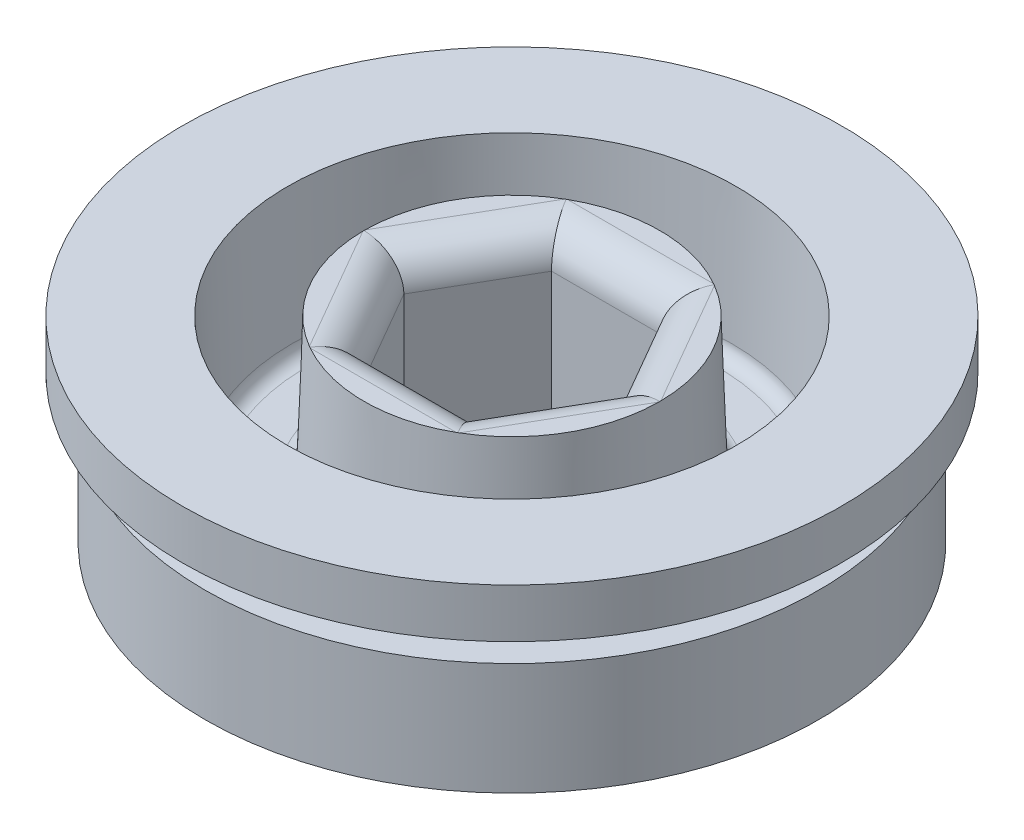
ISO-10303-21;
HEADER;
FILE_DESCRIPTION(('STEP AP214'),'2;1');
FILE_NAME('part.step','',(''),(''),'','','');
FILE_SCHEMA(('AUTOMOTIVE_DESIGN { 1 0 10303 214 1 1 1 1 }'));
ENDSEC;
DATA;
#1=APPLICATION_CONTEXT('core data for automotive mechanical design processes');
#2=APPLICATION_PROTOCOL_DEFINITION('international standard','automotive_design',2000,#1);
#3=PRODUCT_CONTEXT('',#1,'mechanical');
#4=PRODUCT('Part','Part','',(#3));
#5=PRODUCT_RELATED_PRODUCT_CATEGORY('part','',(#4));
#6=PRODUCT_DEFINITION_FORMATION('','',#4);
#7=PRODUCT_DEFINITION_CONTEXT('part definition',#1,'design');
#8=PRODUCT_DEFINITION('design','',#6,#7);
#9=PRODUCT_DEFINITION_SHAPE('','',#8);
#10=(LENGTH_UNIT() NAMED_UNIT(*) SI_UNIT(.MILLI.,.METRE.));
#11=(NAMED_UNIT(*) PLANE_ANGLE_UNIT() SI_UNIT($,.RADIAN.));
#12=(NAMED_UNIT(*) SI_UNIT($,.STERADIAN.) SOLID_ANGLE_UNIT());
#13=UNCERTAINTY_MEASURE_WITH_UNIT(LENGTH_MEASURE(1.E-05),#10,'distance_accuracy_value','');
#14=(GEOMETRIC_REPRESENTATION_CONTEXT(3) GLOBAL_UNCERTAINTY_ASSIGNED_CONTEXT((#13)) GLOBAL_UNIT_ASSIGNED_CONTEXT((#10,
#11,#12)) REPRESENTATION_CONTEXT('',''));
#15=CARTESIAN_POINT('',(0.,0.,0.));
#16=DIRECTION('',(0.,0.,1.));
#17=DIRECTION('',(1.,0.,0.));
#18=AXIS2_PLACEMENT_3D('',#15,#16,#17);
#19=CARTESIAN_POINT('',(0.,1.778,0.));
#20=DIRECTION('',(0.,1.,0.));
#21=DIRECTION('',(0.,0.,1.));
#22=AXIS2_PLACEMENT_3D('',#19,#20,#21);
#23=PLANE('',#22);
#24=DIRECTION('',(0.5,0.,-0.866025403784439));
#25=VECTOR('',#24,1.);
#26=CARTESIAN_POINT('',(3.05758929060134,1.778,4.0259));
#27=LINE('',#26,#25);
#28=CARTESIAN_POINT('',(5.35925593252145,1.778,0.0392964341079192));
#29=VERTEX_POINT('',#28);
#30=CARTESIAN_POINT('',(2.71365967647633,1.778,4.62160356589208));
#31=VERTEX_POINT('',#30);
#32=EDGE_CURVE('E164',#29,#31,#27,.F.);
#33=ORIENTED_EDGE('',*,*,#32,.T.);
#34=CARTESIAN_POINT('',(0.,1.778,0.));
#35=DIRECTION('',(0.,1.,0.));
#36=DIRECTION('',(0.,0.,1.));
#37=AXIS2_PLACEMENT_3D('',#34,#35,#36);
#38=CIRCLE('',#37,5.3594);
#39=EDGE_CURVE('E159',#31,#29,#38,.T.);
#40=ORIENTED_EDGE('',*,*,#39,.T.);
#41=EDGE_LOOP('',(#33,#40));
#42=FACE_BOUND('',#41,.T.);
#43=ADVANCED_FACE('F34',(#42),#23,.T.);
#44=DIRECTION('',(0.5,0.,0.866025403784439));
#45=VECTOR('',#44,1.);
#46=CARTESIAN_POINT('',(4.03645780449889,1.778,-2.33045));
#47=LINE('',#46,#45);
#48=CARTESIAN_POINT('',(2.71365967647633,1.778,-4.62160356589208));
#49=VERTEX_POINT('',#48);
#50=CARTESIAN_POINT('',(5.35925593252145,1.778,-0.0392964341079192));
#51=VERTEX_POINT('',#50);
#52=EDGE_CURVE('E170',#49,#51,#47,.T.);
#53=ORIENTED_EDGE('',*,*,#52,.T.);
#54=EDGE_CURVE('E355',#51,#49,#38,.T.);
#55=ORIENTED_EDGE('',*,*,#54,.T.);
#56=EDGE_LOOP('',(#53,#55));
#57=FACE_BOUND('',#56,.T.);
#58=ADVANCED_FACE('F297',(#57),#23,.T.);
#59=DIRECTION('',(1.,0.,0.));
#60=VECTOR('',#59,1.);
#61=CARTESIAN_POINT('',(0.,1.778,-4.6609));
#62=LINE('',#61,#60);
#63=CARTESIAN_POINT('',(-2.64559625604513,1.778,-4.6609));
#64=VERTEX_POINT('',#63);
#65=CARTESIAN_POINT('',(2.64559625604512,1.778,-4.6609));
#66=VERTEX_POINT('',#65);
#67=EDGE_CURVE('E443',#64,#66,#62,.T.);
#68=ORIENTED_EDGE('',*,*,#67,.T.);
#69=EDGE_CURVE('E357',#66,#64,#38,.T.);
#70=ORIENTED_EDGE('',*,*,#69,.T.);
#71=EDGE_LOOP('',(#68,#70));
#72=FACE_BOUND('',#71,.T.);
#73=ADVANCED_FACE('F304',(#72),#23,.T.);
#74=DIRECTION('',(-0.5,0.,0.866025403784438));
#75=VECTOR('',#74,1.);
#76=CARTESIAN_POINT('',(-3.05758929060134,1.778,-4.0259));
#77=LINE('',#76,#75);
#78=CARTESIAN_POINT('',(-5.35925593252145,1.778,-0.0392964341079235));
#79=VERTEX_POINT('',#78);
#80=CARTESIAN_POINT('',(-2.71365967647633,1.778,-4.62160356589208));
#81=VERTEX_POINT('',#80);
#82=EDGE_CURVE('E167',#79,#81,#77,.F.);
#83=ORIENTED_EDGE('',*,*,#82,.T.);
#84=EDGE_CURVE('E359',#81,#79,#38,.T.);
#85=ORIENTED_EDGE('',*,*,#84,.T.);
#86=EDGE_LOOP('',(#83,#85));
#87=FACE_BOUND('',#86,.T.);
#88=ADVANCED_FACE('F325',(#87),#23,.T.);
#89=DIRECTION('',(-0.5,0.,-0.866025403784439));
#90=VECTOR('',#89,1.);
#91=CARTESIAN_POINT('',(-4.03645780449889,1.778,2.33045));
#92=LINE('',#91,#90);
#93=CARTESIAN_POINT('',(-2.71365967647633,1.778,4.62160356589208));
#94=VERTEX_POINT('',#93);
#95=CARTESIAN_POINT('',(-5.35925593252145,1.778,0.0392964341079187));
#96=VERTEX_POINT('',#95);
#97=EDGE_CURVE('E163',#94,#96,#92,.T.);
#98=ORIENTED_EDGE('',*,*,#97,.T.);
#99=EDGE_CURVE('E157',#96,#94,#38,.T.);
#100=ORIENTED_EDGE('',*,*,#99,.T.);
#101=EDGE_LOOP('',(#98,#100));
#102=FACE_BOUND('',#101,.T.);
#103=ADVANCED_FACE('F321',(#102),#23,.T.);
#104=DIRECTION('',(1.,0.,0.));
#105=VECTOR('',#104,1.);
#106=CARTESIAN_POINT('',(-1.9577370277951,1.778,4.6609));
#107=LINE('',#106,#105);
#108=CARTESIAN_POINT('',(2.64559625604512,1.778,4.6609));
#109=VERTEX_POINT('',#108);
#110=CARTESIAN_POINT('',(-2.64559625604513,1.778,4.6609));
#111=VERTEX_POINT('',#110);
#112=EDGE_CURVE('E156',#109,#111,#107,.F.);
#113=ORIENTED_EDGE('',*,*,#112,.T.);
#114=EDGE_CURVE('E144',#111,#109,#38,.T.);
#115=ORIENTED_EDGE('',*,*,#114,.T.);
#116=EDGE_LOOP('',(#113,#115));
#117=FACE_BOUND('',#116,.T.);
#118=ADVANCED_FACE('F155',(#117),#23,.T.);
#119=CARTESIAN_POINT('',(3.05758929060134,0.508,4.0259));
#120=DIRECTION('',(-0.5,0.,0.866025403784439));
#121=DIRECTION('',(0.866025403784439,0.,0.5));
#122=AXIS2_PLACEMENT_3D('',#119,#120,#121);
#123=CYLINDRICAL_SURFACE('',#122,1.27);
#124=CARTESIAN_POINT('',(2.69097186966593,0.508,4.6609));
#125=DIRECTION('',(-0.866025403784439,0.,0.5));
#126=DIRECTION('',(-0.5,0.,-0.866025403784439));
#127=AXIS2_PLACEMENT_3D('',#124,#125,#126);
#128=ELLIPSE('',#127,1.46646968374165,1.27);
#129=CARTESIAN_POINT('',(2.67970261913006,1.77784999585663,4.64138108550865));
#130=VERTEX_POINT('',#129);
#131=CARTESIAN_POINT('',(1.9577370277951,0.507999999999998,3.3909));
#132=VERTEX_POINT('',#131);
#133=EDGE_CURVE('E199',#130,#132,#128,.T.);
#134=ORIENTED_EDGE('',*,*,#133,.F.);
#135=CARTESIAN_POINT('',(2.64528726503381,1.77738669855972,4.66110000000005));
#136=CARTESIAN_POINT('',(2.70307202135166,1.77842549958261,4.62826566910503));
#137=CARTESIAN_POINT('',(2.76026595597754,1.77810903413084,4.59439620883243));
#138=CARTESIAN_POINT('',(2.87333157492652,1.77521470570281,4.52466381992047));
#139=CARTESIAN_POINT('',(2.92920388608773,1.77263793779373,4.48880186448096));
#140=CARTESIAN_POINT('',(3.09449500058932,1.76220307037123,4.37843720070868));
#141=CARTESIAN_POINT('',(3.2018147805707,1.75164094648161,4.30102683401927));
#142=CARTESIAN_POINT('',(3.41087950412553,1.72635068228522,4.13836618357468));
#143=CARTESIAN_POINT('',(3.51258376613204,1.71159596065141,4.05306829836247));
#144=CARTESIAN_POINT('',(3.70938130575072,1.68083102885802,3.87525940604888));
#145=CARTESIAN_POINT('',(3.80447070148041,1.66482009303136,3.78274422997228));
#146=CARTESIAN_POINT('',(3.99114982946988,1.63370806163654,3.58704740633753));
#147=CARTESIAN_POINT('',(4.08246341922199,1.61866581804661,3.48359208013239));
#148=CARTESIAN_POINT('',(4.25695808428091,1.59303451135323,3.26952688411409));
#149=CARTESIAN_POINT('',(4.34014138772974,1.58244422552927,3.15891898838054));
#150=CARTESIAN_POINT('',(4.49734087179348,1.56791987960325,2.93168426670881));
#151=CARTESIAN_POINT('',(4.57139773390175,1.56395521186988,2.81508769704532));
#152=CARTESIAN_POINT('',(4.71007077020346,1.56345579920134,2.57639531419766));
#153=CARTESIAN_POINT('',(4.77468720551604,1.566920848721,2.45429965323882));
#154=CARTESIAN_POINT('',(4.89099141519145,1.5801758338829,2.21192929155667));
#155=CARTESIAN_POINT('',(4.94316314859997,1.589641823536,2.09186728803069));
#156=CARTESIAN_POINT('',(5.03834619015962,1.61282715341339,1.84855866401153));
#157=CARTESIAN_POINT('',(5.0813553352927,1.62654749609257,1.72531129923101));
#158=CARTESIAN_POINT('',(5.15825191051187,1.65593634123722,1.47593333371397));
#159=CARTESIAN_POINT('',(5.19211837384698,1.67160920318634,1.34979681342963));
#160=CARTESIAN_POINT('',(5.25060377914072,1.70228585310406,1.09531971986488));
#161=CARTESIAN_POINT('',(5.27522239289152,1.71728961730961,0.966979068528461));
#162=CARTESIAN_POINT('',(5.31657096362235,1.7448339605208,0.699441140587472));
#163=CARTESIAN_POINT('',(5.33263107842265,1.75712980358538,0.560110898411375));
#164=CARTESIAN_POINT('',(5.34867875792054,1.7699082209777,0.350339524326568));
#165=CARTESIAN_POINT('',(5.3526875629495,1.77322291732322,0.280364867006831));
#166=CARTESIAN_POINT('',(5.35804439808505,1.77746100886589,0.140199094503678));
#167=CARTESIAN_POINT('',(5.35939070915264,1.77838285924219,0.0700078687607123));
#168=CARTESIAN_POINT('',(5.35940528831935,1.77784845548405,-0.000200000000000654));
#169=B_SPLINE_CURVE_WITH_KNOTS('',3,(#135,#136,#137,#138,#139,#140,#141,#142,#143,#144,#145,
#146,#147,#148,#149,#150,#151,#152,#153,#154,#155,#156,#157,#158,#159,#160,#161,#162,#163,#164,
#165,#166,#167,#168),.UNSPECIFIED.,.F.,.F.,(4,2,2,2,2,2,2,2,2,2,2,2,2,2,2,2,4),(0.,
0.19934792232527,0.398599318244113,0.796322709015103,1.19662621484336,1.59716268778659,
2.01313680518247,2.42899660143442,2.84292993137975,3.25685180989454,3.65013721985643,
4.04351537032652,4.43778812888648,4.83207487893493,5.25385746324227,5.46427993375525,
5.67483821922206),.UNSPECIFIED.);
#170=EDGE_CURVE('E147',#130,#31,#169,.T.);
#171=ORIENTED_EDGE('',*,*,#170,.T.);
#172=ORIENTED_EDGE('',*,*,#32,.F.);
#173=CARTESIAN_POINT('',(5.35940523826011,1.77784999585663,0.));
#174=VERTEX_POINT('',#173);
#175=EDGE_CURVE('E191',#29,#174,#169,.T.);
#176=ORIENTED_EDGE('',*,*,#175,.T.);
#177=CARTESIAN_POINT('',(5.38194373933185,0.508,0.));
#178=DIRECTION('',(0.,0.,1.));
#179=DIRECTION('',(-1.,0.,0.));
#180=AXIS2_PLACEMENT_3D('',#177,#178,#179);
#181=ELLIPSE('',#180,1.46646968374165,1.27);
#182=CARTESIAN_POINT('',(3.9154740555902,0.507999999999998,0.));
#183=VERTEX_POINT('',#182);
#184=EDGE_CURVE('E201',#183,#174,#181,.F.);
#185=ORIENTED_EDGE('',*,*,#184,.F.);
#186=DIRECTION('',(0.5,0.,-0.866025403784439));
#187=VECTOR('',#186,1.);
#188=CARTESIAN_POINT('',(3.9154740555902,0.508,0.));
#189=LINE('',#188,#187);
#190=EDGE_CURVE('E182',#132,#183,#189,.T.);
#191=ORIENTED_EDGE('',*,*,#190,.F.);
#192=EDGE_LOOP('',(#134,#171,#172,#176,#185,#191));
#193=FACE_BOUND('',#192,.T.);
#194=ADVANCED_FACE('F283',(#193),#123,.T.);
#195=CARTESIAN_POINT('',(4.03645780449889,0.508,-2.33045));
#196=DIRECTION('',(0.5,0.,0.866025403784439));
#197=DIRECTION('',(0.866025403784439,0.,-0.5));
#198=AXIS2_PLACEMENT_3D('',#195,#196,#197);
#199=CYLINDRICAL_SURFACE('',#198,1.27);
#200=ORIENTED_EDGE('',*,*,#184,.T.);
#201=CARTESIAN_POINT('',(5.35940528831935,1.77784845548406,0.00020000000000015));
#202=CARTESIAN_POINT('',(5.35939117909812,1.77836172097168,-0.0671206241431395));
#203=CARTESIAN_POINT('',(5.35815274855735,1.77753489802528,-0.134427789213322));
#204=CARTESIAN_POINT('',(5.35322574575262,1.7736595442651,-0.268860876628609));
#205=CARTESIAN_POINT('',(5.34953825935309,1.77061199801933,-0.335986866065626));
#206=CARTESIAN_POINT('',(5.3348165119489,1.75883851007809,-0.53670335798812));
#207=CARTESIAN_POINT('',(5.32012290888584,1.7474802186115,-0.669882365662119));
#208=CARTESIAN_POINT('',(5.28091153510945,1.72086401184019,-0.935226069658365));
#209=CARTESIAN_POINT('',(5.25633104841761,1.70558143153625,-1.06737869404071));
#210=CARTESIAN_POINT('',(5.19737173651987,1.67412266472643,-1.32944996584332));
#211=CARTESIAN_POINT('',(5.16298749421525,1.65794598817947,-1.45936733596652));
#212=CARTESIAN_POINT('',(5.08288029332316,1.6269424818895,-1.72150405314546));
#213=CARTESIAN_POINT('',(5.03676535306327,1.61219352696147,-1.85361369091569));
#214=CARTESIAN_POINT('',(4.93401205009801,1.58768787906917,-2.11413411941268));
#215=CARTESIAN_POINT('',(4.87737756001774,1.57792935389391,-2.24254625129571));
#216=CARTESIAN_POINT('',(4.75410299666031,1.56551293164683,-2.49415214064262));
#217=CARTESIAN_POINT('',(4.68750844482808,1.56282371338717,-2.61736652853362));
#218=CARTESIAN_POINT('',(4.54469595728466,1.56506544626157,-2.85801383093513));
#219=CARTESIAN_POINT('',(4.4684777947719,1.56999657701672,-2.97544660909861));
#220=CARTESIAN_POINT('',(4.3128075421276,1.58579954611525,-3.1955816182586));
#221=CARTESIAN_POINT('',(4.23395127340651,1.59623329337086,-3.2987400525809));
#222=CARTESIAN_POINT('',(4.06908419549062,1.62085850980275,-3.49876891187155));
#223=CARTESIAN_POINT('',(3.98306918977611,1.63505219388316,-3.59563558847177));
#224=CARTESIAN_POINT('',(3.80421241967191,1.66486586578124,-3.78289448266661));
#225=CARTESIAN_POINT('',(3.71136004193233,1.68048808053499,-3.87327618555281));
#226=CARTESIAN_POINT('',(3.5192854617945,1.71058043831451,-4.04719998717587));
#227=CARTESIAN_POINT('',(3.4200633247941,1.72505059316499,-4.13074215611373));
#228=CARTESIAN_POINT('',(3.2117054206504,1.75061994185989,-4.29377464875323));
#229=CARTESIAN_POINT('',(3.1023371561543,1.76157189177316,-4.37299442533467));
#230=CARTESIAN_POINT('',(2.93398231900629,1.77239912177482,-4.48570685006095));
#231=CARTESIAN_POINT('',(2.87719191033604,1.77507483785145,-4.52223258923452));
#232=CARTESIAN_POINT('',(2.76223468444764,1.77809753457828,-4.59322998539146));
#233=CARTESIAN_POINT('',(2.70406702854676,1.77844305763186,-4.62770034332258));
#234=CARTESIAN_POINT('',(2.64528726503381,1.77738669855972,-4.66110000000005));
#235=B_SPLINE_CURVE_WITH_KNOTS('',3,(#201,#202,#203,#204,#205,#206,#207,#208,#209,#210,#211,
#212,#213,#214,#215,#216,#217,#218,#219,#220,#221,#222,#223,#224,#225,#226,#227,#228,#229,#230,
#231,#232,#233,#234),.UNSPECIFIED.,.F.,.F.,(4,2,2,2,2,2,2,2,2,2,2,2,2,2,2,2,4),(0.,
0.201905994844267,0.40372252814954,0.80660861293346,1.21209169834652,1.61779927047402,
2.03942655095987,2.46089892179066,2.88050075000415,3.30011246890391,3.69047295293634,
4.0810639039255,4.4722744795117,4.86348103920857,5.26940034060541,5.4720511439428,
5.67482869890448),.UNSPECIFIED.);
#236=EDGE_CURVE('E346',#174,#51,#235,.T.);
#237=ORIENTED_EDGE('',*,*,#236,.T.);
#238=ORIENTED_EDGE('',*,*,#52,.F.);
#239=CARTESIAN_POINT('',(2.67970261913006,1.77784999585663,-4.64138108550865));
#240=VERTEX_POINT('',#239);
#241=EDGE_CURVE('E151',#49,#240,#235,.T.);
#242=ORIENTED_EDGE('',*,*,#241,.T.);
#243=CARTESIAN_POINT('',(2.69097186966593,0.508,-4.6609));
#244=DIRECTION('',(0.866025403784438,0.,0.5));
#245=DIRECTION('',(-0.5,0.,0.866025403784439));
#246=AXIS2_PLACEMENT_3D('',#243,#244,#245);
#247=ELLIPSE('',#246,1.46646968374165,1.27);
#248=CARTESIAN_POINT('',(1.9577370277951,0.507999999999998,-3.3909));
#249=VERTEX_POINT('',#248);
#250=EDGE_CURVE('E196',#249,#240,#247,.F.);
#251=ORIENTED_EDGE('',*,*,#250,.F.);
#252=DIRECTION('',(0.5,0.,0.866025403784439));
#253=VECTOR('',#252,1.);
#254=CARTESIAN_POINT('',(1.9577370277951,0.508,-3.3909));
#255=LINE('',#254,#253);
#256=EDGE_CURVE('E57',#183,#249,#255,.F.);
#257=ORIENTED_EDGE('',*,*,#256,.F.);
#258=EDGE_LOOP('',(#200,#237,#238,#242,#251,#257));
#259=FACE_BOUND('',#258,.T.);
#260=ADVANCED_FACE('F278',(#259),#199,.T.);
#261=CARTESIAN_POINT('',(-1.9577370277951,0.508,4.6609));
#262=DIRECTION('',(-1.,0.,0.));
#263=DIRECTION('',(0.,0.,1.));
#264=AXIS2_PLACEMENT_3D('',#261,#262,#263);
#265=CYLINDRICAL_SURFACE('',#264,1.27);
#266=ORIENTED_EDGE('',*,*,#112,.F.);
#267=CARTESIAN_POINT('',(2.64524387455951,1.77799998425197,4.6611));
#268=CARTESIAN_POINT('',(2.65291964393405,1.77800104982709,4.6567438418261));
#269=CARTESIAN_POINT('',(2.66058486154689,1.77797913820297,4.65236953011289));
#270=CARTESIAN_POINT('',(2.67589419324905,1.77788936055627,4.64358459960794));
#271=CARTESIAN_POINT('',(2.68353830733838,1.77782149453368,4.63917398081619));
#272=CARTESIAN_POINT('',(2.691171869666,1.77773065131185,4.63474520848515));
#273=B_SPLINE_CURVE_WITH_KNOTS('',3,(#267,#268,#269,#270,#271,#272),.UNSPECIFIED.,.F.,.F.,(4,2,
4),(0.,0.0264767029144758,0.0529534058286229),.UNSPECIFIED.);
#274=EDGE_CURVE('E141',#109,#130,#273,.T.);
#275=ORIENTED_EDGE('',*,*,#274,.T.);
#276=ORIENTED_EDGE('',*,*,#133,.T.);
#277=DIRECTION('',(1.,0.,0.));
#278=VECTOR('',#277,1.);
#279=CARTESIAN_POINT('',(1.9577370277951,0.508,3.3909));
#280=LINE('',#279,#278);
#281=CARTESIAN_POINT('',(-1.9577370277951,0.507999999999998,3.3909));
#282=VERTEX_POINT('',#281);
#283=EDGE_CURVE('E179',#282,#132,#280,.T.);
#284=ORIENTED_EDGE('',*,*,#283,.F.);
#285=CARTESIAN_POINT('',(-2.69097186966593,0.508,4.6609));
#286=DIRECTION('',(-0.866025403784438,0.,-0.5));
#287=DIRECTION('',(0.5,0.,-0.866025403784438));
#288=AXIS2_PLACEMENT_3D('',#285,#286,#287);
#289=ELLIPSE('',#288,1.46646968374165,1.27);
#290=CARTESIAN_POINT('',(-2.67970261913006,1.77784999585663,4.64138108550865));
#291=VERTEX_POINT('',#290);
#292=EDGE_CURVE('E194',#291,#282,#289,.T.);
#293=ORIENTED_EDGE('',*,*,#292,.F.);
#294=CARTESIAN_POINT('',(-2.691171869666,1.77773065131185,4.63474520848515));
#295=CARTESIAN_POINT('',(-2.68353830733838,1.77782149453368,4.63917398081619));
#296=CARTESIAN_POINT('',(-2.67589419324905,1.77788936055627,4.64358459960794));
#297=CARTESIAN_POINT('',(-2.66058486154689,1.77797913820297,4.65236953011289));
#298=CARTESIAN_POINT('',(-2.65291964393405,1.77800104982709,4.6567438418261));
#299=CARTESIAN_POINT('',(-2.6452438745595,1.77799998425197,4.6611));
#300=B_SPLINE_CURVE_WITH_KNOTS('',3,(#294,#295,#296,#297,#298,#299),.UNSPECIFIED.,.F.,.F.,(4,2,
4),(0.,0.0264767029141487,0.0529534058286253),.UNSPECIFIED.);
#301=EDGE_CURVE('E162',#291,#111,#300,.T.);
#302=ORIENTED_EDGE('',*,*,#301,.T.);
#303=EDGE_LOOP('',(#266,#275,#276,#284,#293,#302));
#304=FACE_BOUND('',#303,.T.);
#305=ADVANCED_FACE('F160',(#304),#265,.T.);
#306=CARTESIAN_POINT('',(0.,0.508,-4.6609));
#307=DIRECTION('',(1.,0.,0.));
#308=DIRECTION('',(0.,0.,-1.));
#309=AXIS2_PLACEMENT_3D('',#306,#307,#308);
#310=CYLINDRICAL_SURFACE('',#309,1.27);
#311=ORIENTED_EDGE('',*,*,#67,.F.);
#312=CARTESIAN_POINT('',(-2.64524387455951,1.77799998425197,-4.6611));
#313=CARTESIAN_POINT('',(-2.65291964393405,1.77800104982709,-4.6567438418261));
#314=CARTESIAN_POINT('',(-2.66058486154689,1.77797913820297,-4.65236953011289));
#315=CARTESIAN_POINT('',(-2.67589419324905,1.77788936055627,-4.64358459960794));
#316=CARTESIAN_POINT('',(-2.68353830733838,1.77782149453368,-4.63917398081619));
#317=CARTESIAN_POINT('',(-2.691171869666,1.77773065131185,-4.63474520848515));
#318=B_SPLINE_CURVE_WITH_KNOTS('',3,(#312,#313,#314,#315,#316,#317),.UNSPECIFIED.,.F.,.F.,(4,2,
4),(0.,0.0264767029144742,0.0529534058286198),.UNSPECIFIED.);
#319=CARTESIAN_POINT('',(-2.67970261913007,1.77784999585663,-4.64138108550864));
#320=VERTEX_POINT('',#319);
#321=EDGE_CURVE('E239',#64,#320,#318,.T.);
#322=ORIENTED_EDGE('',*,*,#321,.T.);
#323=CARTESIAN_POINT('',(-2.69097186966593,0.508,-4.6609));
#324=DIRECTION('',(0.866025403784439,0.,-0.5));
#325=DIRECTION('',(-0.5,0.,-0.866025403784439));
#326=AXIS2_PLACEMENT_3D('',#323,#324,#325);
#327=ELLIPSE('',#326,1.46646968374165,1.27);
#328=CARTESIAN_POINT('',(-1.9577370277951,0.507999999999998,-3.3909));
#329=VERTEX_POINT('',#328);
#330=EDGE_CURVE('E190',#329,#320,#327,.F.);
#331=ORIENTED_EDGE('',*,*,#330,.F.);
#332=DIRECTION('',(1.,0.,0.));
#333=VECTOR('',#332,1.);
#334=CARTESIAN_POINT('',(-1.9577370277951,0.508,-3.3909));
#335=LINE('',#334,#333);
#336=EDGE_CURVE('E185',#249,#329,#335,.F.);
#337=ORIENTED_EDGE('',*,*,#336,.F.);
#338=ORIENTED_EDGE('',*,*,#250,.T.);
#339=CARTESIAN_POINT('',(2.691171869666,1.77773065131185,-4.63474520848515));
#340=CARTESIAN_POINT('',(2.68353830733838,1.77782149453368,-4.63917398081619));
#341=CARTESIAN_POINT('',(2.67589419324905,1.77788936055627,-4.64358459960794));
#342=CARTESIAN_POINT('',(2.66058486154689,1.77797913820297,-4.65236953011289));
#343=CARTESIAN_POINT('',(2.65291964393405,1.77800104982709,-4.6567438418261));
#344=CARTESIAN_POINT('',(2.64524387455951,1.77799998425197,-4.6611));
#345=B_SPLINE_CURVE_WITH_KNOTS('',3,(#339,#340,#341,#342,#343,#344),.UNSPECIFIED.,.F.,.F.,(4,2,
4),(0.,0.0264767029141475,0.0529534058286229),.UNSPECIFIED.);
#346=EDGE_CURVE('E254',#240,#66,#345,.T.);
#347=ORIENTED_EDGE('',*,*,#346,.T.);
#348=EDGE_LOOP('',(#311,#322,#331,#337,#338,#347));
#349=FACE_BOUND('',#348,.T.);
#350=ADVANCED_FACE('F277',(#349),#310,.T.);
#351=CARTESIAN_POINT('',(-4.03645780449889,0.508,2.33045));
#352=DIRECTION('',(-0.5,0.,-0.866025403784439));
#353=DIRECTION('',(-0.866025403784439,0.,0.5));
#354=AXIS2_PLACEMENT_3D('',#351,#352,#353);
#355=CYLINDRICAL_SURFACE('',#354,1.27);
#356=CARTESIAN_POINT('',(-5.38194373933185,0.508,0.));
#357=DIRECTION('',(0.,0.,-1.));
#358=DIRECTION('',(1.,0.,0.));
#359=AXIS2_PLACEMENT_3D('',#356,#357,#358);
#360=ELLIPSE('',#359,1.46646968374165,1.27);
#361=CARTESIAN_POINT('',(-5.35940523826011,1.77784999585663,0.));
#362=VERTEX_POINT('',#361);
#363=CARTESIAN_POINT('',(-3.9154740555902,0.507999999999998,0.));
#364=VERTEX_POINT('',#363);
#365=EDGE_CURVE('E188',#362,#364,#360,.T.);
#366=ORIENTED_EDGE('',*,*,#365,.F.);
#367=CARTESIAN_POINT('',(-5.35940528831935,1.77784845548406,-0.000200000000001869));
#368=CARTESIAN_POINT('',(-5.35939117909812,1.77836172097168,0.0671206241431379));
#369=CARTESIAN_POINT('',(-5.35815274855735,1.77753489802528,0.134427789213321));
#370=CARTESIAN_POINT('',(-5.35322574575262,1.7736595442651,0.268860876628608));
#371=CARTESIAN_POINT('',(-5.34953825935309,1.77061199801933,0.335986866065624));
#372=CARTESIAN_POINT('',(-5.3348165119489,1.75883851007809,0.536703357988118));
#373=CARTESIAN_POINT('',(-5.32012290888584,1.7474802186115,0.669882365662117));
#374=CARTESIAN_POINT('',(-5.28091153510945,1.72086401184019,0.935226069658363));
#375=CARTESIAN_POINT('',(-5.25633104841761,1.70558143153625,1.06737869404071));
#376=CARTESIAN_POINT('',(-5.19737173651987,1.67412266472643,1.32944996584332));
#377=CARTESIAN_POINT('',(-5.16298749421525,1.65794598817947,1.45936733596652));
#378=CARTESIAN_POINT('',(-5.08288029332316,1.6269424818895,1.72150405314546));
#379=CARTESIAN_POINT('',(-5.03676535306327,1.61219352696147,1.85361369091569));
#380=CARTESIAN_POINT('',(-4.93401205009801,1.58768787906917,2.11413411941268));
#381=CARTESIAN_POINT('',(-4.87737756001774,1.57792935389391,2.24254625129571));
#382=CARTESIAN_POINT('',(-4.75410299666031,1.56551293164683,2.49415214064262));
#383=CARTESIAN_POINT('',(-4.68750844482808,1.56282371338716,2.61736652853361));
#384=CARTESIAN_POINT('',(-4.54469595728466,1.56506544626157,2.85801383093513));
#385=CARTESIAN_POINT('',(-4.46847779477191,1.56999657701672,2.97544660909861));
#386=CARTESIAN_POINT('',(-4.3128075421276,1.58579954611525,3.1955816182586));
#387=CARTESIAN_POINT('',(-4.23395127340651,1.59623329337086,3.2987400525809));
#388=CARTESIAN_POINT('',(-4.06908419549062,1.62085850980275,3.49876891187155));
#389=CARTESIAN_POINT('',(-3.98306918977611,1.63505219388315,3.59563558847177));
#390=CARTESIAN_POINT('',(-3.80421241967191,1.66486586578124,3.78289448266661));
#391=CARTESIAN_POINT('',(-3.71136004193234,1.68048808053499,3.87327618555281));
#392=CARTESIAN_POINT('',(-3.5192854617945,1.71058043831451,4.04719998717587));
#393=CARTESIAN_POINT('',(-3.4200633247941,1.72505059316499,4.13074215611373));
#394=CARTESIAN_POINT('',(-3.2117054206504,1.75061994185989,4.29377464875323));
#395=CARTESIAN_POINT('',(-3.1023371561543,1.76157189177316,4.37299442533466));
#396=CARTESIAN_POINT('',(-2.93398231900629,1.77239912177482,4.48570685006095));
#397=CARTESIAN_POINT('',(-2.87719191033605,1.77507483785145,4.52223258923452));
#398=CARTESIAN_POINT('',(-2.76223468444764,1.77809753457828,4.59322998539146));
#399=CARTESIAN_POINT('',(-2.70406702854676,1.77844305763186,4.62770034332258));
#400=CARTESIAN_POINT('',(-2.64528726503382,1.77738669855972,4.66110000000004));
#401=B_SPLINE_CURVE_WITH_KNOTS('',3,(#367,#368,#369,#370,#371,#372,#373,#374,#375,#376,#377,
#378,#379,#380,#381,#382,#383,#384,#385,#386,#387,#388,#389,#390,#391,#392,#393,#394,#395,#396,
#397,#398,#399,#400),.UNSPECIFIED.,.F.,.F.,(4,2,2,2,2,2,2,2,2,2,2,2,2,2,2,2,4),(0.,
0.201905994844267,0.40372252814954,0.80660861293346,1.21209169834652,1.61779927047402,
2.03942655095987,2.46089892179066,2.88050075000415,3.30011246890391,3.69047295293634,
4.0810639039255,4.4722744795117,4.86348103920857,5.26940034060541,5.47205114394279,
5.67482869890447),.UNSPECIFIED.);
#402=EDGE_CURVE('E49',#362,#96,#401,.T.);
#403=ORIENTED_EDGE('',*,*,#402,.T.);
#404=ORIENTED_EDGE('',*,*,#97,.F.);
#405=EDGE_CURVE('E336',#94,#291,#401,.T.);
#406=ORIENTED_EDGE('',*,*,#405,.T.);
#407=ORIENTED_EDGE('',*,*,#292,.T.);
#408=DIRECTION('',(-0.5,0.,-0.866025403784439));
#409=VECTOR('',#408,1.);
#410=CARTESIAN_POINT('',(-1.9577370277951,0.508,3.3909));
#411=LINE('',#410,#409);
#412=EDGE_CURVE('E176',#364,#282,#411,.F.);
#413=ORIENTED_EDGE('',*,*,#412,.F.);
#414=EDGE_LOOP('',(#366,#403,#404,#406,#407,#413));
#415=FACE_BOUND('',#414,.T.);
#416=ADVANCED_FACE('F316',(#415),#355,.T.);
#417=CARTESIAN_POINT('',(-3.05758929060134,0.508,-4.0259));
#418=DIRECTION('',(0.5,0.,-0.866025403784438));
#419=DIRECTION('',(-0.866025403784438,0.,-0.5));
#420=AXIS2_PLACEMENT_3D('',#417,#418,#419);
#421=CYLINDRICAL_SURFACE('',#420,1.27);
#422=ORIENTED_EDGE('',*,*,#330,.T.);
#423=CARTESIAN_POINT('',(-2.64528726503382,1.77738669855972,-4.66110000000004));
#424=CARTESIAN_POINT('',(-2.70307202135166,1.77842549958261,-4.62826566910503));
#425=CARTESIAN_POINT('',(-2.76026595597755,1.77810903413084,-4.59439620883243));
#426=CARTESIAN_POINT('',(-2.87333157492652,1.77521470570281,-4.52466381992047));
#427=CARTESIAN_POINT('',(-2.92920388608773,1.77263793779373,-4.48880186448096));
#428=CARTESIAN_POINT('',(-3.09449500058933,1.76220307037123,-4.37843720070868));
#429=CARTESIAN_POINT('',(-3.2018147805707,1.7516409464816,-4.30102683401927));
#430=CARTESIAN_POINT('',(-3.41087950412553,1.72635068228522,-4.13836618357468));
#431=CARTESIAN_POINT('',(-3.51258376613205,1.71159596065141,-4.05306829836247));
#432=CARTESIAN_POINT('',(-3.70938130575072,1.68083102885802,-3.87525940604888));
#433=CARTESIAN_POINT('',(-3.80447070148041,1.66482009303136,-3.78274422997227));
#434=CARTESIAN_POINT('',(-3.99114982946989,1.63370806163654,-3.58704740633752));
#435=CARTESIAN_POINT('',(-4.082463419222,1.61866581804661,-3.48359208013239));
#436=CARTESIAN_POINT('',(-4.25695808428092,1.59303451135323,-3.26952688411408));
#437=CARTESIAN_POINT('',(-4.34014138772975,1.58244422552927,-3.15891898838053));
#438=CARTESIAN_POINT('',(-4.49734087179349,1.56791987960325,-2.9316842667088));
#439=CARTESIAN_POINT('',(-4.57139773390176,1.56395521186988,-2.81508769704531));
#440=CARTESIAN_POINT('',(-4.71007077020347,1.56345579920134,-2.57639531419764));
#441=CARTESIAN_POINT('',(-4.77468720551605,1.566920848721,-2.4542996532388));
#442=CARTESIAN_POINT('',(-4.89099141519146,1.5801758338829,-2.21192929155666));
#443=CARTESIAN_POINT('',(-4.94316314859997,1.589641823536,-2.09186728803068));
#444=CARTESIAN_POINT('',(-5.03834619015962,1.6128271534134,-1.84855866401151));
#445=CARTESIAN_POINT('',(-5.0813553352927,1.62654749609258,-1.725311299231));
#446=CARTESIAN_POINT('',(-5.15825191051187,1.65593634123722,-1.47593333371396));
#447=CARTESIAN_POINT('',(-5.19211837384698,1.67160920318634,-1.34979681342962));
#448=CARTESIAN_POINT('',(-5.25060377914072,1.70228585310406,-1.09531971986487));
#449=CARTESIAN_POINT('',(-5.27522239289153,1.71728961730961,-0.966979068528451));
#450=CARTESIAN_POINT('',(-5.31657096362235,1.7448339605208,-0.699441140587463));
#451=CARTESIAN_POINT('',(-5.33263107842265,1.75712980358538,-0.560110898411369));
#452=CARTESIAN_POINT('',(-5.34867875792054,1.7699082209777,-0.350339524326565));
#453=CARTESIAN_POINT('',(-5.3526875629495,1.77322291732322,-0.280364867006829));
#454=CARTESIAN_POINT('',(-5.35804439808505,1.7774610088659,-0.140199094503679));
#455=CARTESIAN_POINT('',(-5.35939070915264,1.77838285924219,-0.0700078687607136));
#456=CARTESIAN_POINT('',(-5.35940528831935,1.77784845548405,0.00019999999999834));
#457=B_SPLINE_CURVE_WITH_KNOTS('',3,(#423,#424,#425,#426,#427,#428,#429,#430,#431,#432,#433,
#434,#435,#436,#437,#438,#439,#440,#441,#442,#443,#444,#445,#446,#447,#448,#449,#450,#451,#452,
#453,#454,#455,#456),.UNSPECIFIED.,.F.,.F.,(4,2,2,2,2,2,2,2,2,2,2,2,2,2,2,2,4),(0.,
0.199347922325269,0.398599318244114,0.796322709015105,1.19662621484336,1.5971626877866,
2.01313680518248,2.42899660143443,2.84292993137976,3.25685180989455,3.65013721985644,
4.04351537032653,4.43778812888649,4.83207487893494,5.25385746324227,5.46427993375525,
5.67483821922205),.UNSPECIFIED.);
#458=EDGE_CURVE('E212',#320,#81,#457,.T.);
#459=ORIENTED_EDGE('',*,*,#458,.T.);
#460=ORIENTED_EDGE('',*,*,#82,.F.);
#461=EDGE_CURVE('E187',#79,#362,#457,.T.);
#462=ORIENTED_EDGE('',*,*,#461,.T.);
#463=ORIENTED_EDGE('',*,*,#365,.T.);
#464=DIRECTION('',(-0.5,0.,0.866025403784438));
#465=VECTOR('',#464,1.);
#466=CARTESIAN_POINT('',(-3.9154740555902,0.508,0.));
#467=LINE('',#466,#465);
#468=EDGE_CURVE('E432',#329,#364,#467,.T.);
#469=ORIENTED_EDGE('',*,*,#468,.F.);
#470=EDGE_LOOP('',(#422,#459,#460,#462,#463,#469));
#471=FACE_BOUND('',#470,.T.);
#472=ADVANCED_FACE('F215',(#471),#421,.T.);
#473=CARTESIAN_POINT('',(0.,1.778,0.));
#474=DIRECTION('',(0.,1.,0.));
#475=DIRECTION('',(0.,0.,1.));
#476=AXIS2_PLACEMENT_3D('',#473,#474,#475);
#477=CIRCLE('',#476,8.128);
#478=CARTESIAN_POINT('',(0.,1.778,8.128));
#479=VERTEX_POINT('',#478);
#480=EDGE_CURVE('E338',#479,#479,#477,.T.);
#481=ORIENTED_EDGE('',*,*,#480,.F.);
#482=EDGE_LOOP('',(#481));
#483=FACE_BOUND('',#482,.T.);
#484=CARTESIAN_POINT('',(0.,1.778,0.));
#485=DIRECTION('',(0.,1.,0.));
#486=DIRECTION('',(0.,0.,1.));
#487=AXIS2_PLACEMENT_3D('',#484,#485,#486);
#488=CIRCLE('',#487,11.938);
#489=CARTESIAN_POINT('',(0.,1.778,11.938));
#490=VERTEX_POINT('',#489);
#491=EDGE_CURVE('E428',#490,#490,#488,.T.);
#492=ORIENTED_EDGE('',*,*,#491,.T.);
#493=EDGE_LOOP('',(#492));
#494=FACE_BOUND('',#493,.T.);
#495=ADVANCED_FACE('F300',(#483,#494),#23,.T.);
#496=CARTESIAN_POINT('',(0.,-5.334,0.));
#497=DIRECTION('',(0.,1.,0.));
#498=DIRECTION('',(0.,0.,1.));
#499=AXIS2_PLACEMENT_3D('',#496,#497,#498);
#500=PLANE('',#499);
#501=CARTESIAN_POINT('',(0.,-5.334,0.));
#502=DIRECTION('',(0.,1.,0.));
#503=DIRECTION('',(0.,0.,1.));
#504=AXIS2_PLACEMENT_3D('',#501,#502,#503);
#505=CIRCLE('',#504,11.1125);
#506=CARTESIAN_POINT('',(0.,-5.334,11.1125));
#507=VERTEX_POINT('',#506);
#508=EDGE_CURVE('E429',#507,#507,#505,.T.);
#509=ORIENTED_EDGE('',*,*,#508,.F.);
#510=EDGE_LOOP('',(#509));
#511=FACE_BOUND('',#510,.T.);
#512=DIRECTION('',(0.5,0.,0.866025403784439));
#513=VECTOR('',#512,1.);
#514=CARTESIAN_POINT('',(1.9577370277951,-5.334,-3.3909));
#515=LINE('',#514,#513);
#516=CARTESIAN_POINT('',(1.9577370277951,-5.334,-3.3909));
#517=VERTEX_POINT('',#516);
#518=CARTESIAN_POINT('',(3.9154740555902,-5.334,0.));
#519=VERTEX_POINT('',#518);
#520=EDGE_CURVE('E204',#517,#519,#515,.T.);
#521=ORIENTED_EDGE('',*,*,#520,.F.);
#522=DIRECTION('',(1.,0.,0.));
#523=VECTOR('',#522,1.);
#524=CARTESIAN_POINT('',(-1.9577370277951,-5.334,-3.3909));
#525=LINE('',#524,#523);
#526=CARTESIAN_POINT('',(-1.9577370277951,-5.334,-3.3909));
#527=VERTEX_POINT('',#526);
#528=EDGE_CURVE('E648',#527,#517,#525,.T.);
#529=ORIENTED_EDGE('',*,*,#528,.F.);
#530=DIRECTION('',(-0.5,0.,0.866025403784438));
#531=VECTOR('',#530,1.);
#532=CARTESIAN_POINT('',(-1.9577370277951,-5.334,-3.3909));
#533=LINE('',#532,#531);
#534=CARTESIAN_POINT('',(-3.9154740555902,-5.334,0.));
#535=VERTEX_POINT('',#534);
#536=EDGE_CURVE('E659',#527,#535,#533,.T.);
#537=ORIENTED_EDGE('',*,*,#536,.T.);
#538=DIRECTION('',(-0.5,0.,-0.866025403784439));
#539=VECTOR('',#538,1.);
#540=CARTESIAN_POINT('',(-1.9577370277951,-5.334,3.3909));
#541=LINE('',#540,#539);
#542=CARTESIAN_POINT('',(-1.9577370277951,-5.334,3.3909));
#543=VERTEX_POINT('',#542);
#544=EDGE_CURVE('E657',#543,#535,#541,.T.);
#545=ORIENTED_EDGE('',*,*,#544,.F.);
#546=DIRECTION('',(1.,0.,0.));
#547=VECTOR('',#546,1.);
#548=CARTESIAN_POINT('',(-1.9577370277951,-5.334,3.3909));
#549=LINE('',#548,#547);
#550=CARTESIAN_POINT('',(1.9577370277951,-5.334,3.3909));
#551=VERTEX_POINT('',#550);
#552=EDGE_CURVE('E653',#543,#551,#549,.T.);
#553=ORIENTED_EDGE('',*,*,#552,.T.);
#554=DIRECTION('',(0.5,0.,-0.866025403784439));
#555=VECTOR('',#554,1.);
#556=CARTESIAN_POINT('',(1.9577370277951,-5.334,3.3909));
#557=LINE('',#556,#555);
#558=EDGE_CURVE('E651',#551,#519,#557,.T.);
#559=ORIENTED_EDGE('',*,*,#558,.T.);
#560=EDGE_LOOP('',(#521,#529,#537,#545,#553,#559));
#561=FACE_BOUND('',#560,.T.);
#562=ADVANCED_FACE('F308',(#511,#561),#500,.F.);
#563=CARTESIAN_POINT('',(0.,0.,0.));
#564=DIRECTION('',(0.,1.,0.));
#565=DIRECTION('',(0.,0.,1.));
#566=AXIS2_PLACEMENT_3D('',#563,#564,#565);
#567=PLANE('',#566);
#568=CARTESIAN_POINT('',(0.,0.,0.));
#569=DIRECTION('',(0.,1.,0.));
#570=DIRECTION('',(0.,0.,1.));
#571=AXIS2_PLACEMENT_3D('',#568,#569,#570);
#572=CIRCLE('',#571,11.938);
#573=CARTESIAN_POINT('',(0.,0.,11.938));
#574=VERTEX_POINT('',#573);
#575=EDGE_CURVE('E425',#574,#574,#572,.T.);
#576=ORIENTED_EDGE('',*,*,#575,.F.);
#577=EDGE_LOOP('',(#576));
#578=FACE_BOUND('',#577,.T.);
#579=CARTESIAN_POINT('',(0.,0.,0.));
#580=DIRECTION('',(0.,1.,0.));
#581=DIRECTION('',(0.,0.,1.));
#582=AXIS2_PLACEMENT_3D('',#579,#580,#581);
#583=CIRCLE('',#582,10.1346);
#584=CARTESIAN_POINT('',(0.,0.,10.1346));
#585=VERTEX_POINT('',#584);
#586=EDGE_CURVE('E678',#585,#585,#583,.T.);
#587=ORIENTED_EDGE('',*,*,#586,.T.);
#588=EDGE_LOOP('',(#587));
#589=FACE_BOUND('',#588,.T.);
#590=ADVANCED_FACE('F314',(#578,#589),#567,.F.);
#591=CARTESIAN_POINT('',(0.,35.54376301522,0.));
#592=DIRECTION('',(0.,-1.,0.));
#593=DIRECTION('',(0.,0.,-1.));
#594=AXIS2_PLACEMENT_3D('',#591,#592,#593);
#595=CYLINDRICAL_SURFACE('',#594,11.938);
#596=ORIENTED_EDGE('',*,*,#575,.T.);
#597=EDGE_LOOP('',(#596));
#598=FACE_BOUND('',#597,.T.);
#599=ORIENTED_EDGE('',*,*,#491,.F.);
#600=EDGE_LOOP('',(#599));
#601=FACE_BOUND('',#600,.T.);
#602=ADVANCED_FACE('F413',(#598,#601),#595,.T.);
#603=CARTESIAN_POINT('',(0.,-1.27,0.));
#604=DIRECTION('',(0.,1.,0.));
#605=DIRECTION('',(0.,0.,1.));
#606=AXIS2_PLACEMENT_3D('',#603,#604,#605);
#607=PLANE('',#606);
#608=CARTESIAN_POINT('',(0.,-1.27,0.));
#609=DIRECTION('',(0.,1.,0.));
#610=DIRECTION('',(0.,0.,1.));
#611=AXIS2_PLACEMENT_3D('',#608,#609,#610);
#612=CIRCLE('',#611,10.1346);
#613=CARTESIAN_POINT('',(0.,-1.27,10.1346));
#614=VERTEX_POINT('',#613);
#615=EDGE_CURVE('E440',#614,#614,#612,.T.);
#616=ORIENTED_EDGE('',*,*,#615,.F.);
#617=EDGE_LOOP('',(#616));
#618=FACE_BOUND('',#617,.T.);
#619=CARTESIAN_POINT('',(0.,-1.27,0.));
#620=DIRECTION('',(0.,1.,0.));
#621=DIRECTION('',(0.,0.,1.));
#622=AXIS2_PLACEMENT_3D('',#619,#620,#621);
#623=CIRCLE('',#622,11.1125);
#624=CARTESIAN_POINT('',(0.,-1.27,11.1125));
#625=VERTEX_POINT('',#624);
#626=EDGE_CURVE('E434',#625,#625,#623,.T.);
#627=ORIENTED_EDGE('',*,*,#626,.T.);
#628=EDGE_LOOP('',(#627));
#629=FACE_BOUND('',#628,.T.);
#630=ADVANCED_FACE('F409',(#618,#629),#607,.T.);
#631=CARTESIAN_POINT('',(0.,-1.27,0.));
#632=DIRECTION('',(0.,1.,0.));
#633=DIRECTION('',(0.,0.,1.));
#634=AXIS2_PLACEMENT_3D('',#631,#632,#633);
#635=CYLINDRICAL_SURFACE('',#634,10.1346);
#636=ORIENTED_EDGE('',*,*,#615,.T.);
#637=EDGE_LOOP('',(#636));
#638=FACE_BOUND('',#637,.T.);
#639=ORIENTED_EDGE('',*,*,#586,.F.);
#640=EDGE_LOOP('',(#639));
#641=FACE_BOUND('',#640,.T.);
#642=ADVANCED_FACE('F406',(#638,#641),#635,.T.);
#643=CARTESIAN_POINT('',(0.,1.778,0.));
#644=DIRECTION('',(0.,-1.,0.));
#645=DIRECTION('',(0.,0.,-1.));
#646=AXIS2_PLACEMENT_3D('',#643,#644,#645);
#647=CYLINDRICAL_SURFACE('',#646,11.1125);
#648=ORIENTED_EDGE('',*,*,#508,.T.);
#649=EDGE_LOOP('',(#648));
#650=FACE_BOUND('',#649,.T.);
#651=ORIENTED_EDGE('',*,*,#626,.F.);
#652=EDGE_LOOP('',(#651));
#653=FACE_BOUND('',#652,.T.);
#654=ADVANCED_FACE('F405',(#650,#653),#647,.T.);
#655=CARTESIAN_POINT('',(1.9577370277951,-5.334,-3.3909));
#656=DIRECTION('',(-0.866025403784439,0.,0.5));
#657=DIRECTION('',(0.5,0.,0.866025403784439));
#658=AXIS2_PLACEMENT_3D('',#655,#656,#657);
#659=PLANE('',#658);
#660=DIRECTION('',(0.,1.,0.));
#661=VECTOR('',#660,1.);
#662=CARTESIAN_POINT('',(3.9154740555902,-5.334,0.));
#663=LINE('',#662,#661);
#664=EDGE_CURVE('E676',#519,#183,#663,.T.);
#665=ORIENTED_EDGE('',*,*,#664,.T.);
#666=ORIENTED_EDGE('',*,*,#256,.T.);
#667=DIRECTION('',(0.,1.,0.));
#668=VECTOR('',#667,1.);
#669=CARTESIAN_POINT('',(1.9577370277951,-5.334,-3.3909));
#670=LINE('',#669,#668);
#671=EDGE_CURVE('E662',#517,#249,#670,.T.);
#672=ORIENTED_EDGE('',*,*,#671,.F.);
#673=ORIENTED_EDGE('',*,*,#520,.T.);
#674=EDGE_LOOP('',(#665,#666,#672,#673));
#675=FACE_BOUND('',#674,.T.);
#676=ADVANCED_FACE('F401',(#675),#659,.T.);
#677=CARTESIAN_POINT('',(1.9577370277951,-5.334,3.3909));
#678=DIRECTION('',(0.866025403784439,0.,0.5));
#679=DIRECTION('',(0.5,0.,-0.866025403784439));
#680=AXIS2_PLACEMENT_3D('',#677,#678,#679);
#681=PLANE('',#680);
#682=DIRECTION('',(0.,1.,0.));
#683=VECTOR('',#682,1.);
#684=CARTESIAN_POINT('',(1.9577370277951,-5.334,3.3909));
#685=LINE('',#684,#683);
#686=EDGE_CURVE('E673',#551,#132,#685,.T.);
#687=ORIENTED_EDGE('',*,*,#686,.T.);
#688=ORIENTED_EDGE('',*,*,#190,.T.);
#689=ORIENTED_EDGE('',*,*,#664,.F.);
#690=ORIENTED_EDGE('',*,*,#558,.F.);
#691=EDGE_LOOP('',(#687,#688,#689,#690));
#692=FACE_BOUND('',#691,.T.);
#693=ADVANCED_FACE('F397',(#692),#681,.F.);
#694=CARTESIAN_POINT('',(-1.9577370277951,-5.334,3.3909));
#695=DIRECTION('',(0.,0.,1.));
#696=DIRECTION('',(1.,0.,0.));
#697=AXIS2_PLACEMENT_3D('',#694,#695,#696);
#698=PLANE('',#697);
#699=DIRECTION('',(0.,1.,0.));
#700=VECTOR('',#699,1.);
#701=CARTESIAN_POINT('',(-1.9577370277951,-5.334,3.3909));
#702=LINE('',#701,#700);
#703=EDGE_CURVE('E670',#543,#282,#702,.T.);
#704=ORIENTED_EDGE('',*,*,#703,.T.);
#705=ORIENTED_EDGE('',*,*,#283,.T.);
#706=ORIENTED_EDGE('',*,*,#686,.F.);
#707=ORIENTED_EDGE('',*,*,#552,.F.);
#708=EDGE_LOOP('',(#704,#705,#706,#707));
#709=FACE_BOUND('',#708,.T.);
#710=ADVANCED_FACE('F393',(#709),#698,.F.);
#711=CARTESIAN_POINT('',(-1.9577370277951,-5.334,3.3909));
#712=DIRECTION('',(0.866025403784439,0.,-0.5));
#713=DIRECTION('',(-0.5,0.,-0.866025403784439));
#714=AXIS2_PLACEMENT_3D('',#711,#712,#713);
#715=PLANE('',#714);
#716=DIRECTION('',(0.,1.,0.));
#717=VECTOR('',#716,1.);
#718=CARTESIAN_POINT('',(-3.9154740555902,-5.334,0.));
#719=LINE('',#718,#717);
#720=EDGE_CURVE('E667',#535,#364,#719,.T.);
#721=ORIENTED_EDGE('',*,*,#720,.T.);
#722=ORIENTED_EDGE('',*,*,#412,.T.);
#723=ORIENTED_EDGE('',*,*,#703,.F.);
#724=ORIENTED_EDGE('',*,*,#544,.T.);
#725=EDGE_LOOP('',(#721,#722,#723,#724));
#726=FACE_BOUND('',#725,.T.);
#727=ADVANCED_FACE('F389',(#726),#715,.T.);
#728=CARTESIAN_POINT('',(-1.9577370277951,-5.334,-3.3909));
#729=DIRECTION('',(-0.866025403784438,0.,-0.5));
#730=DIRECTION('',(-0.5,0.,0.866025403784438));
#731=AXIS2_PLACEMENT_3D('',#728,#729,#730);
#732=PLANE('',#731);
#733=DIRECTION('',(0.,1.,0.));
#734=VECTOR('',#733,1.);
#735=CARTESIAN_POINT('',(-1.9577370277951,-5.334,-3.3909));
#736=LINE('',#735,#734);
#737=EDGE_CURVE('E664',#527,#329,#736,.T.);
#738=ORIENTED_EDGE('',*,*,#737,.T.);
#739=ORIENTED_EDGE('',*,*,#468,.T.);
#740=ORIENTED_EDGE('',*,*,#720,.F.);
#741=ORIENTED_EDGE('',*,*,#536,.F.);
#742=EDGE_LOOP('',(#738,#739,#740,#741));
#743=FACE_BOUND('',#742,.T.);
#744=ADVANCED_FACE('F383',(#743),#732,.F.);
#745=CARTESIAN_POINT('',(-1.9577370277951,-5.334,-3.3909));
#746=DIRECTION('',(0.,0.,1.));
#747=DIRECTION('',(1.,0.,0.));
#748=AXIS2_PLACEMENT_3D('',#745,#746,#747);
#749=PLANE('',#748);
#750=ORIENTED_EDGE('',*,*,#671,.T.);
#751=ORIENTED_EDGE('',*,*,#336,.T.);
#752=ORIENTED_EDGE('',*,*,#737,.F.);
#753=ORIENTED_EDGE('',*,*,#528,.T.);
#754=EDGE_LOOP('',(#750,#751,#752,#753));
#755=FACE_BOUND('',#754,.T.);
#756=ADVANCED_FACE('F378',(#755),#749,.T.);
#757=CARTESIAN_POINT('',(0.,1.778,0.));
#758=DIRECTION('',(0.,1.,0.));
#759=DIRECTION('',(0.,0.,1.));
#760=AXIS2_PLACEMENT_3D('',#757,#758,#759);
#761=CONICAL_SURFACE('',#760,8.128,0.0349065850398867);
#762=CARTESIAN_POINT('',(0.,-3.06572894432486,0.));
#763=DIRECTION('',(0.,-1.,0.));
#764=DIRECTION('',(0.,0.,-1.));
#765=AXIS2_PLACEMENT_3D('',#762,#763,#764);
#766=CIRCLE('',#765,7.95885325805473);
#767=CARTESIAN_POINT('',(0.,-3.06572894432486,-7.95885325805473));
#768=VERTEX_POINT('',#767);
#769=EDGE_CURVE('E42',#768,#768,#766,.T.);
#770=ORIENTED_EDGE('',*,*,#769,.T.);
#771=EDGE_LOOP('',(#770));
#772=FACE_BOUND('',#771,.T.);
#773=ORIENTED_EDGE('',*,*,#480,.T.);
#774=EDGE_LOOP('',(#773));
#775=FACE_BOUND('',#774,.T.);
#776=ADVANCED_FACE('F375',(#772,#775),#761,.F.);
#777=CARTESIAN_POINT('',(0.,-3.556,0.));
#778=DIRECTION('',(0.,1.,0.));
#779=DIRECTION('',(0.,0.,1.));
#780=AXIS2_PLACEMENT_3D('',#777,#778,#779);
#781=PLANE('',#780);
#782=CARTESIAN_POINT('',(0.,-3.556,0.));
#783=DIRECTION('',(0.,1.,0.));
#784=DIRECTION('',(0.,0.,1.));
#785=AXIS2_PLACEMENT_3D('',#782,#783,#784);
#786=CIRCLE('',#785,7.45116271792902);
#787=CARTESIAN_POINT('',(0.,-3.556,7.45116271792902));
#788=VERTEX_POINT('',#787);
#789=EDGE_CURVE('E367',#788,#788,#786,.T.);
#790=ORIENTED_EDGE('',*,*,#789,.T.);
#791=EDGE_LOOP('',(#790));
#792=FACE_BOUND('',#791,.T.);
#793=CARTESIAN_POINT('',(0.,-3.556,0.));
#794=DIRECTION('',(0.,1.,0.));
#795=DIRECTION('',(0.,0.,1.));
#796=AXIS2_PLACEMENT_3D('',#793,#794,#795);
#797=CIRCLE('',#796,6.03623728207098);
#798=CARTESIAN_POINT('',(0.,-3.556,6.03623728207098));
#799=VERTEX_POINT('',#798);
#800=EDGE_CURVE('E213',#799,#799,#797,.F.);
#801=ORIENTED_EDGE('',*,*,#800,.T.);
#802=EDGE_LOOP('',(#801));
#803=FACE_BOUND('',#802,.T.);
#804=ADVANCED_FACE('F223',(#792,#803),#781,.T.);
#805=CARTESIAN_POINT('',(0.,1.778,0.));
#806=DIRECTION('',(0.,-1.,0.));
#807=DIRECTION('',(0.,0.,1.));
#808=AXIS2_PLACEMENT_3D('',#805,#806,#807);
#809=CONICAL_SURFACE('',#808,5.3594,0.0349065850398867);
#810=CARTESIAN_POINT('',(0.,-3.06572894432487,0.));
#811=DIRECTION('',(0.,-1.,0.));
#812=DIRECTION('',(0.,0.,-1.));
#813=AXIS2_PLACEMENT_3D('',#810,#811,#812);
#814=CIRCLE('',#813,5.52854674194527);
#815=CARTESIAN_POINT('',(0.,-3.06572894432487,-5.52854674194527));
#816=VERTEX_POINT('',#815);
#817=EDGE_CURVE('E11',#816,#816,#814,.F.);
#818=ORIENTED_EDGE('',*,*,#817,.T.);
#819=EDGE_LOOP('',(#818));
#820=FACE_BOUND('',#819,.T.);
#821=ORIENTED_EDGE('',*,*,#39,.F.);
#822=ORIENTED_EDGE('',*,*,#170,.F.);
#823=ORIENTED_EDGE('',*,*,#274,.F.);
#824=ORIENTED_EDGE('',*,*,#114,.F.);
#825=ORIENTED_EDGE('',*,*,#301,.F.);
#826=ORIENTED_EDGE('',*,*,#405,.F.);
#827=ORIENTED_EDGE('',*,*,#99,.F.);
#828=ORIENTED_EDGE('',*,*,#402,.F.);
#829=ORIENTED_EDGE('',*,*,#461,.F.);
#830=ORIENTED_EDGE('',*,*,#84,.F.);
#831=ORIENTED_EDGE('',*,*,#458,.F.);
#832=ORIENTED_EDGE('',*,*,#321,.F.);
#833=ORIENTED_EDGE('',*,*,#69,.F.);
#834=ORIENTED_EDGE('',*,*,#346,.F.);
#835=ORIENTED_EDGE('',*,*,#241,.F.);
#836=ORIENTED_EDGE('',*,*,#54,.F.);
#837=ORIENTED_EDGE('',*,*,#236,.F.);
#838=ORIENTED_EDGE('',*,*,#175,.F.);
#839=EDGE_LOOP('',(#821,#822,#823,#824,#825,#826,#827,#828,#829,#830,#831,#832,#833,#834,#835,
#836,#837,#838));
#840=FACE_BOUND('',#839,.T.);
#841=ADVANCED_FACE('F143',(#820,#840),#809,.T.);
#842=CARTESIAN_POINT('',(0.,-3.048,0.));
#843=DIRECTION('',(0.,1.,0.));
#844=DIRECTION('',(0.,0.,1.));
#845=AXIS2_PLACEMENT_3D('',#842,#843,#844);
#846=TOROIDAL_SURFACE('',#845,7.45116271792902,0.508);
#847=ORIENTED_EDGE('',*,*,#769,.F.);
#848=EDGE_LOOP('',(#847));
#849=FACE_BOUND('',#848,.T.);
#850=ORIENTED_EDGE('',*,*,#789,.F.);
#851=EDGE_LOOP('',(#850));
#852=FACE_BOUND('',#851,.T.);
#853=ADVANCED_FACE('F222',(#849,#852),#846,.F.);
#854=CARTESIAN_POINT('',(0.,-3.048,0.));
#855=DIRECTION('',(0.,1.,0.));
#856=DIRECTION('',(0.,0.,1.));
#857=AXIS2_PLACEMENT_3D('',#854,#855,#856);
#858=TOROIDAL_SURFACE('',#857,6.03623728207098,0.508);
#859=ORIENTED_EDGE('',*,*,#800,.F.);
#860=EDGE_LOOP('',(#859));
#861=FACE_BOUND('',#860,.T.);
#862=ORIENTED_EDGE('',*,*,#817,.F.);
#863=EDGE_LOOP('',(#862));
#864=FACE_BOUND('',#863,.T.);
#865=ADVANCED_FACE('F36',(#861,#864),#858,.F.);
#866=CLOSED_SHELL('',(#43,#58,#73,#88,#103,#118,#194,#260,#305,#350,#416,#472,#495,#562,#590,
#602,#630,#642,#654,#676,#693,#710,#727,#744,#756,#776,#804,#841,#853,#865));
#867=MANIFOLD_SOLID_BREP('B2',#866);
#868=ADVANCED_BREP_SHAPE_REPRESENTATION('',(#18,#867),#14);
#869=SHAPE_DEFINITION_REPRESENTATION(#9,#868);
ENDSEC;
END-ISO-10303-21;
